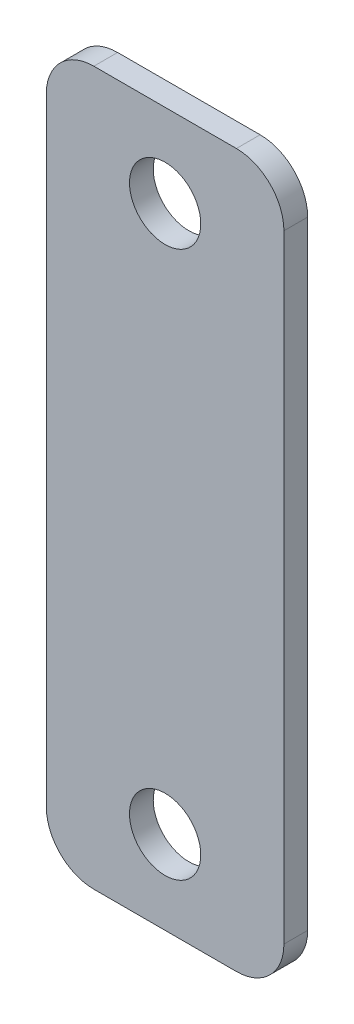
ISO-10303-21;
HEADER;
FILE_DESCRIPTION(('STEP AP214'),'2;1');
FILE_NAME('part.step','',(''),(''),'','','');
FILE_SCHEMA(('AUTOMOTIVE_DESIGN { 1 0 10303 214 1 1 1 1 }'));
ENDSEC;
DATA;
#1=APPLICATION_CONTEXT('core data for automotive mechanical design processes');
#2=APPLICATION_PROTOCOL_DEFINITION('international standard','automotive_design',2000,#1);
#3=PRODUCT_CONTEXT('',#1,'mechanical');
#4=PRODUCT('Part','Part','',(#3));
#5=PRODUCT_RELATED_PRODUCT_CATEGORY('part','',(#4));
#6=PRODUCT_DEFINITION_FORMATION('','',#4);
#7=PRODUCT_DEFINITION_CONTEXT('part definition',#1,'design');
#8=PRODUCT_DEFINITION('design','',#6,#7);
#9=PRODUCT_DEFINITION_SHAPE('','',#8);
#10=(LENGTH_UNIT() NAMED_UNIT(*) SI_UNIT(.MILLI.,.METRE.));
#11=(NAMED_UNIT(*) PLANE_ANGLE_UNIT() SI_UNIT($,.RADIAN.));
#12=(NAMED_UNIT(*) SI_UNIT($,.STERADIAN.) SOLID_ANGLE_UNIT());
#13=UNCERTAINTY_MEASURE_WITH_UNIT(LENGTH_MEASURE(1.E-05),#10,'distance_accuracy_value','');
#14=(GEOMETRIC_REPRESENTATION_CONTEXT(3) GLOBAL_UNCERTAINTY_ASSIGNED_CONTEXT((#13)) GLOBAL_UNIT_ASSIGNED_CONTEXT((#10,
#11,#12)) REPRESENTATION_CONTEXT('',''));
#15=CARTESIAN_POINT('',(0.,0.,0.));
#16=DIRECTION('',(0.,0.,1.));
#17=DIRECTION('',(1.,0.,0.));
#18=AXIS2_PLACEMENT_3D('',#15,#16,#17);
#19=CARTESIAN_POINT('',(5.,-15.,0.5));
#20=DIRECTION('',(-1.,0.,0.));
#21=DIRECTION('',(0.,0.,1.));
#22=AXIS2_PLACEMENT_3D('',#19,#20,#21);
#23=PLANE('',#22);
#24=DIRECTION('',(0.,1.,0.));
#25=VECTOR('',#24,1.);
#26=CARTESIAN_POINT('',(5.,-15.,0.5));
#27=LINE('',#26,#25);
#28=CARTESIAN_POINT('',(5.,-13.,0.5));
#29=VERTEX_POINT('',#28);
#30=CARTESIAN_POINT('',(5.,13.,0.5));
#31=VERTEX_POINT('',#30);
#32=EDGE_CURVE('E119',#29,#31,#27,.T.);
#33=ORIENTED_EDGE('',*,*,#32,.F.);
#34=DIRECTION('',(0.,0.,-1.));
#35=VECTOR('',#34,1.);
#36=CARTESIAN_POINT('',(5.,-13.,0.5));
#37=LINE('',#36,#35);
#38=CARTESIAN_POINT('',(5.,-13.,-0.5));
#39=VERTEX_POINT('',#38);
#40=EDGE_CURVE('E104',#29,#39,#37,.T.);
#41=ORIENTED_EDGE('',*,*,#40,.T.);
#42=DIRECTION('',(0.,1.,0.));
#43=VECTOR('',#42,1.);
#44=CARTESIAN_POINT('',(5.,-15.,-0.5));
#45=LINE('',#44,#43);
#46=CARTESIAN_POINT('',(5.,13.,-0.5));
#47=VERTEX_POINT('',#46);
#48=EDGE_CURVE('E116',#39,#47,#45,.T.);
#49=ORIENTED_EDGE('',*,*,#48,.T.);
#50=DIRECTION('',(0.,0.,-1.));
#51=VECTOR('',#50,1.);
#52=CARTESIAN_POINT('',(5.,13.,0.5));
#53=LINE('',#52,#51);
#54=EDGE_CURVE('E121',#47,#31,#53,.F.);
#55=ORIENTED_EDGE('',*,*,#54,.T.);
#56=EDGE_LOOP('',(#33,#41,#49,#55));
#57=FACE_BOUND('',#56,.T.);
#58=ADVANCED_FACE('F34',(#57),#23,.F.);
#59=CARTESIAN_POINT('',(-5.,15.,0.5));
#60=DIRECTION('',(0.,-1.,0.));
#61=DIRECTION('',(0.,0.,-1.));
#62=AXIS2_PLACEMENT_3D('',#59,#60,#61);
#63=PLANE('',#62);
#64=DIRECTION('',(-1.,0.,0.));
#65=VECTOR('',#64,1.);
#66=CARTESIAN_POINT('',(-5.,15.,-0.5));
#67=LINE('',#66,#65);
#68=CARTESIAN_POINT('',(3.,15.,-0.5));
#69=VERTEX_POINT('',#68);
#70=CARTESIAN_POINT('',(-3.,15.,-0.5));
#71=VERTEX_POINT('',#70);
#72=EDGE_CURVE('E125',#69,#71,#67,.T.);
#73=ORIENTED_EDGE('',*,*,#72,.T.);
#74=DIRECTION('',(0.,0.,-1.));
#75=VECTOR('',#74,1.);
#76=CARTESIAN_POINT('',(-3.,15.,0.5));
#77=LINE('',#76,#75);
#78=CARTESIAN_POINT('',(-3.,15.,0.5));
#79=VERTEX_POINT('',#78);
#80=EDGE_CURVE('E11',#71,#79,#77,.F.);
#81=ORIENTED_EDGE('',*,*,#80,.T.);
#82=DIRECTION('',(-1.,0.,0.));
#83=VECTOR('',#82,1.);
#84=CARTESIAN_POINT('',(-5.,15.,0.5));
#85=LINE('',#84,#83);
#86=CARTESIAN_POINT('',(3.,15.,0.5));
#87=VERTEX_POINT('',#86);
#88=EDGE_CURVE('E168',#87,#79,#85,.T.);
#89=ORIENTED_EDGE('',*,*,#88,.F.);
#90=DIRECTION('',(0.,0.,-1.));
#91=VECTOR('',#90,1.);
#92=CARTESIAN_POINT('',(3.,15.,0.5));
#93=LINE('',#92,#91);
#94=EDGE_CURVE('E42',#87,#69,#93,.T.);
#95=ORIENTED_EDGE('',*,*,#94,.T.);
#96=EDGE_LOOP('',(#73,#81,#89,#95));
#97=FACE_BOUND('',#96,.T.);
#98=ADVANCED_FACE('F166',(#97),#63,.F.);
#99=CARTESIAN_POINT('',(-5.,-15.,0.5));
#100=DIRECTION('',(1.,0.,0.));
#101=DIRECTION('',(0.,0.,-1.));
#102=AXIS2_PLACEMENT_3D('',#99,#100,#101);
#103=PLANE('',#102);
#104=DIRECTION('',(0.,-1.,0.));
#105=VECTOR('',#104,1.);
#106=CARTESIAN_POINT('',(-5.,-15.,-0.5));
#107=LINE('',#106,#105);
#108=CARTESIAN_POINT('',(-5.,13.,-0.5));
#109=VERTEX_POINT('',#108);
#110=CARTESIAN_POINT('',(-5.,-13.,-0.5));
#111=VERTEX_POINT('',#110);
#112=EDGE_CURVE('E129',#109,#111,#107,.T.);
#113=ORIENTED_EDGE('',*,*,#112,.T.);
#114=DIRECTION('',(0.,0.,-1.));
#115=VECTOR('',#114,1.);
#116=CARTESIAN_POINT('',(-5.,-13.,0.5));
#117=LINE('',#116,#115);
#118=CARTESIAN_POINT('',(-5.,-13.,0.5));
#119=VERTEX_POINT('',#118);
#120=EDGE_CURVE('E49',#111,#119,#117,.F.);
#121=ORIENTED_EDGE('',*,*,#120,.T.);
#122=DIRECTION('',(0.,-1.,0.));
#123=VECTOR('',#122,1.);
#124=CARTESIAN_POINT('',(-5.,-15.,0.5));
#125=LINE('',#124,#123);
#126=CARTESIAN_POINT('',(-5.,13.,0.5));
#127=VERTEX_POINT('',#126);
#128=EDGE_CURVE('E176',#127,#119,#125,.T.);
#129=ORIENTED_EDGE('',*,*,#128,.F.);
#130=DIRECTION('',(0.,0.,-1.));
#131=VECTOR('',#130,1.);
#132=CARTESIAN_POINT('',(-5.,13.,0.5));
#133=LINE('',#132,#131);
#134=EDGE_CURVE('E159',#127,#109,#133,.T.);
#135=ORIENTED_EDGE('',*,*,#134,.T.);
#136=EDGE_LOOP('',(#113,#121,#129,#135));
#137=FACE_BOUND('',#136,.T.);
#138=ADVANCED_FACE('F175',(#137),#103,.F.);
#139=CARTESIAN_POINT('',(-5.,-15.,0.5));
#140=DIRECTION('',(0.,1.,0.));
#141=DIRECTION('',(0.,0.,1.));
#142=AXIS2_PLACEMENT_3D('',#139,#140,#141);
#143=PLANE('',#142);
#144=DIRECTION('',(1.,0.,0.));
#145=VECTOR('',#144,1.);
#146=CARTESIAN_POINT('',(-5.,-15.,-0.5));
#147=LINE('',#146,#145);
#148=CARTESIAN_POINT('',(-3.,-15.,-0.5));
#149=VERTEX_POINT('',#148);
#150=CARTESIAN_POINT('',(3.,-15.,-0.5));
#151=VERTEX_POINT('',#150);
#152=EDGE_CURVE('E139',#149,#151,#147,.T.);
#153=ORIENTED_EDGE('',*,*,#152,.T.);
#154=DIRECTION('',(0.,0.,-1.));
#155=VECTOR('',#154,1.);
#156=CARTESIAN_POINT('',(3.,-15.,0.5));
#157=LINE('',#156,#155);
#158=CARTESIAN_POINT('',(3.,-15.,0.5));
#159=VERTEX_POINT('',#158);
#160=EDGE_CURVE('E105',#151,#159,#157,.F.);
#161=ORIENTED_EDGE('',*,*,#160,.T.);
#162=DIRECTION('',(1.,0.,0.));
#163=VECTOR('',#162,1.);
#164=CARTESIAN_POINT('',(-5.,-15.,0.5));
#165=LINE('',#164,#163);
#166=CARTESIAN_POINT('',(-3.,-15.,0.5));
#167=VERTEX_POINT('',#166);
#168=EDGE_CURVE('E135',#167,#159,#165,.T.);
#169=ORIENTED_EDGE('',*,*,#168,.F.);
#170=DIRECTION('',(0.,0.,-1.));
#171=VECTOR('',#170,1.);
#172=CARTESIAN_POINT('',(-3.,-15.,0.5));
#173=LINE('',#172,#171);
#174=EDGE_CURVE('E110',#167,#149,#173,.T.);
#175=ORIENTED_EDGE('',*,*,#174,.T.);
#176=EDGE_LOOP('',(#153,#161,#169,#175));
#177=FACE_BOUND('',#176,.T.);
#178=ADVANCED_FACE('F193',(#177),#143,.F.);
#179=CARTESIAN_POINT('',(0.,0.,0.5));
#180=DIRECTION('',(0.,0.,-1.));
#181=DIRECTION('',(-1.,0.,0.));
#182=AXIS2_PLACEMENT_3D('',#179,#180,#181);
#183=PLANE('',#182);
#184=CARTESIAN_POINT('',(0.,11.5,0.5));
#185=DIRECTION('',(0.,0.,1.));
#186=DIRECTION('',(1.,0.,0.));
#187=AXIS2_PLACEMENT_3D('',#184,#185,#186);
#188=CIRCLE('',#187,1.5);
#189=CARTESIAN_POINT('',(1.5,11.5,0.5));
#190=VERTEX_POINT('',#189);
#191=EDGE_CURVE('E142',#190,#190,#188,.T.);
#192=ORIENTED_EDGE('',*,*,#191,.F.);
#193=EDGE_LOOP('',(#192));
#194=FACE_BOUND('',#193,.T.);
#195=CARTESIAN_POINT('',(0.,-11.5,0.5));
#196=DIRECTION('',(0.,0.,1.));
#197=DIRECTION('',(1.,0.,0.));
#198=AXIS2_PLACEMENT_3D('',#195,#196,#197);
#199=CIRCLE('',#198,1.5);
#200=CARTESIAN_POINT('',(1.5,-11.5,0.5));
#201=VERTEX_POINT('',#200);
#202=EDGE_CURVE('E182',#201,#201,#199,.T.);
#203=ORIENTED_EDGE('',*,*,#202,.F.);
#204=EDGE_LOOP('',(#203));
#205=FACE_BOUND('',#204,.T.);
#206=ORIENTED_EDGE('',*,*,#168,.T.);
#207=CARTESIAN_POINT('',(3.,-13.,0.5));
#208=DIRECTION('',(0.,0.,-1.));
#209=DIRECTION('',(-1.,0.,0.));
#210=AXIS2_PLACEMENT_3D('',#207,#208,#209);
#211=CIRCLE('',#210,2.);
#212=EDGE_CURVE('E157',#159,#29,#211,.F.);
#213=ORIENTED_EDGE('',*,*,#212,.T.);
#214=ORIENTED_EDGE('',*,*,#32,.T.);
#215=CARTESIAN_POINT('',(3.,13.,0.5));
#216=DIRECTION('',(0.,0.,-1.));
#217=DIRECTION('',(-1.,0.,0.));
#218=AXIS2_PLACEMENT_3D('',#215,#216,#217);
#219=CIRCLE('',#218,2.);
#220=EDGE_CURVE('E152',#31,#87,#219,.F.);
#221=ORIENTED_EDGE('',*,*,#220,.T.);
#222=ORIENTED_EDGE('',*,*,#88,.T.);
#223=CARTESIAN_POINT('',(-3.,13.,0.5));
#224=DIRECTION('',(0.,0.,-1.));
#225=DIRECTION('',(-1.,0.,0.));
#226=AXIS2_PLACEMENT_3D('',#223,#224,#225);
#227=CIRCLE('',#226,2.);
#228=EDGE_CURVE('E56',#79,#127,#227,.F.);
#229=ORIENTED_EDGE('',*,*,#228,.T.);
#230=ORIENTED_EDGE('',*,*,#128,.T.);
#231=CARTESIAN_POINT('',(-3.,-13.,0.5));
#232=DIRECTION('',(0.,0.,-1.));
#233=DIRECTION('',(-1.,0.,0.));
#234=AXIS2_PLACEMENT_3D('',#231,#232,#233);
#235=CIRCLE('',#234,2.);
#236=EDGE_CURVE('E155',#119,#167,#235,.F.);
#237=ORIENTED_EDGE('',*,*,#236,.T.);
#238=EDGE_LOOP('',(#206,#213,#214,#221,#222,#229,#230,#237));
#239=FACE_BOUND('',#238,.T.);
#240=ADVANCED_FACE('F190',(#194,#205,#239),#183,.F.);
#241=CARTESIAN_POINT('',(0.,0.,-0.5));
#242=DIRECTION('',(0.,0.,-1.));
#243=DIRECTION('',(-1.,0.,0.));
#244=AXIS2_PLACEMENT_3D('',#241,#242,#243);
#245=PLANE('',#244);
#246=CARTESIAN_POINT('',(0.,11.5,-0.5));
#247=DIRECTION('',(0.,0.,-1.));
#248=DIRECTION('',(-1.,0.,0.));
#249=AXIS2_PLACEMENT_3D('',#246,#247,#248);
#250=CIRCLE('',#249,1.5);
#251=CARTESIAN_POINT('',(-1.5,11.5,-0.5));
#252=VERTEX_POINT('',#251);
#253=EDGE_CURVE('E126',#252,#252,#250,.T.);
#254=ORIENTED_EDGE('',*,*,#253,.F.);
#255=EDGE_LOOP('',(#254));
#256=FACE_BOUND('',#255,.T.);
#257=CARTESIAN_POINT('',(0.,-11.5,-0.5));
#258=DIRECTION('',(0.,0.,-1.));
#259=DIRECTION('',(-1.,0.,0.));
#260=AXIS2_PLACEMENT_3D('',#257,#258,#259);
#261=CIRCLE('',#260,1.5);
#262=CARTESIAN_POINT('',(-1.5,-11.5,-0.5));
#263=VERTEX_POINT('',#262);
#264=EDGE_CURVE('E132',#263,#263,#261,.T.);
#265=ORIENTED_EDGE('',*,*,#264,.F.);
#266=EDGE_LOOP('',(#265));
#267=FACE_BOUND('',#266,.T.);
#268=ORIENTED_EDGE('',*,*,#48,.F.);
#269=CARTESIAN_POINT('',(3.,-13.,-0.5));
#270=DIRECTION('',(0.,0.,-1.));
#271=DIRECTION('',(-1.,0.,0.));
#272=AXIS2_PLACEMENT_3D('',#269,#270,#271);
#273=CIRCLE('',#272,2.);
#274=EDGE_CURVE('E100',#39,#151,#273,.T.);
#275=ORIENTED_EDGE('',*,*,#274,.T.);
#276=ORIENTED_EDGE('',*,*,#152,.F.);
#277=CARTESIAN_POINT('',(-3.,-13.,-0.5));
#278=DIRECTION('',(0.,0.,-1.));
#279=DIRECTION('',(-1.,0.,0.));
#280=AXIS2_PLACEMENT_3D('',#277,#278,#279);
#281=CIRCLE('',#280,2.);
#282=EDGE_CURVE('E111',#149,#111,#281,.T.);
#283=ORIENTED_EDGE('',*,*,#282,.T.);
#284=ORIENTED_EDGE('',*,*,#112,.F.);
#285=CARTESIAN_POINT('',(-3.,13.,-0.5));
#286=DIRECTION('',(0.,0.,-1.));
#287=DIRECTION('',(-1.,0.,0.));
#288=AXIS2_PLACEMENT_3D('',#285,#286,#287);
#289=CIRCLE('',#288,2.);
#290=EDGE_CURVE('E146',#109,#71,#289,.T.);
#291=ORIENTED_EDGE('',*,*,#290,.T.);
#292=ORIENTED_EDGE('',*,*,#72,.F.);
#293=CARTESIAN_POINT('',(3.,13.,-0.5));
#294=DIRECTION('',(0.,0.,-1.));
#295=DIRECTION('',(-1.,0.,0.));
#296=AXIS2_PLACEMENT_3D('',#293,#294,#295);
#297=CIRCLE('',#296,2.);
#298=EDGE_CURVE('E120',#69,#47,#297,.T.);
#299=ORIENTED_EDGE('',*,*,#298,.T.);
#300=EDGE_LOOP('',(#268,#275,#276,#283,#284,#291,#292,#299));
#301=FACE_BOUND('',#300,.T.);
#302=ADVANCED_FACE('F123',(#256,#267,#301),#245,.T.);
#303=CARTESIAN_POINT('',(0.,-11.5,-9.5));
#304=DIRECTION('',(0.,0.,1.));
#305=DIRECTION('',(1.,0.,0.));
#306=AXIS2_PLACEMENT_3D('',#303,#304,#305);
#307=CYLINDRICAL_SURFACE('',#306,1.5);
#308=ORIENTED_EDGE('',*,*,#264,.T.);
#309=EDGE_LOOP('',(#308));
#310=FACE_BOUND('',#309,.T.);
#311=ORIENTED_EDGE('',*,*,#202,.T.);
#312=EDGE_LOOP('',(#311));
#313=FACE_BOUND('',#312,.T.);
#314=ADVANCED_FACE('F220',(#310,#313),#307,.F.);
#315=CARTESIAN_POINT('',(0.,11.5,-9.5));
#316=DIRECTION('',(0.,0.,1.));
#317=DIRECTION('',(1.,0.,0.));
#318=AXIS2_PLACEMENT_3D('',#315,#316,#317);
#319=CYLINDRICAL_SURFACE('',#318,1.5);
#320=ORIENTED_EDGE('',*,*,#253,.T.);
#321=EDGE_LOOP('',(#320));
#322=FACE_BOUND('',#321,.T.);
#323=ORIENTED_EDGE('',*,*,#191,.T.);
#324=EDGE_LOOP('',(#323));
#325=FACE_BOUND('',#324,.T.);
#326=ADVANCED_FACE('F188',(#322,#325),#319,.F.);
#327=CARTESIAN_POINT('',(3.,-13.,0.5));
#328=DIRECTION('',(0.,0.,-1.));
#329=DIRECTION('',(-1.,0.,0.));
#330=AXIS2_PLACEMENT_3D('',#327,#328,#329);
#331=CYLINDRICAL_SURFACE('',#330,2.);
#332=ORIENTED_EDGE('',*,*,#212,.F.);
#333=ORIENTED_EDGE('',*,*,#160,.F.);
#334=ORIENTED_EDGE('',*,*,#274,.F.);
#335=ORIENTED_EDGE('',*,*,#40,.F.);
#336=EDGE_LOOP('',(#332,#333,#334,#335));
#337=FACE_BOUND('',#336,.T.);
#338=ADVANCED_FACE('F103',(#337),#331,.T.);
#339=CARTESIAN_POINT('',(-3.,-13.,0.5));
#340=DIRECTION('',(0.,0.,-1.));
#341=DIRECTION('',(-1.,0.,0.));
#342=AXIS2_PLACEMENT_3D('',#339,#340,#341);
#343=CYLINDRICAL_SURFACE('',#342,2.);
#344=ORIENTED_EDGE('',*,*,#236,.F.);
#345=ORIENTED_EDGE('',*,*,#120,.F.);
#346=ORIENTED_EDGE('',*,*,#282,.F.);
#347=ORIENTED_EDGE('',*,*,#174,.F.);
#348=EDGE_LOOP('',(#344,#345,#346,#347));
#349=FACE_BOUND('',#348,.T.);
#350=ADVANCED_FACE('F200',(#349),#343,.T.);
#351=CARTESIAN_POINT('',(-3.,13.,0.5));
#352=DIRECTION('',(0.,0.,-1.));
#353=DIRECTION('',(-1.,0.,0.));
#354=AXIS2_PLACEMENT_3D('',#351,#352,#353);
#355=CYLINDRICAL_SURFACE('',#354,2.);
#356=ORIENTED_EDGE('',*,*,#228,.F.);
#357=ORIENTED_EDGE('',*,*,#80,.F.);
#358=ORIENTED_EDGE('',*,*,#290,.F.);
#359=ORIENTED_EDGE('',*,*,#134,.F.);
#360=EDGE_LOOP('',(#356,#357,#358,#359));
#361=FACE_BOUND('',#360,.T.);
#362=ADVANCED_FACE('F174',(#361),#355,.T.);
#363=CARTESIAN_POINT('',(3.,13.,0.5));
#364=DIRECTION('',(0.,0.,-1.));
#365=DIRECTION('',(-1.,0.,0.));
#366=AXIS2_PLACEMENT_3D('',#363,#364,#365);
#367=CYLINDRICAL_SURFACE('',#366,2.);
#368=ORIENTED_EDGE('',*,*,#220,.F.);
#369=ORIENTED_EDGE('',*,*,#54,.F.);
#370=ORIENTED_EDGE('',*,*,#298,.F.);
#371=ORIENTED_EDGE('',*,*,#94,.F.);
#372=EDGE_LOOP('',(#368,#369,#370,#371));
#373=FACE_BOUND('',#372,.T.);
#374=ADVANCED_FACE('F36',(#373),#367,.T.);
#375=CLOSED_SHELL('',(#58,#98,#138,#178,#240,#302,#314,#326,#338,#350,#362,#374));
#376=MANIFOLD_SOLID_BREP('B2',#375);
#377=ADVANCED_BREP_SHAPE_REPRESENTATION('',(#18,#376),#14);
#378=SHAPE_DEFINITION_REPRESENTATION(#9,#377);
ENDSEC;
END-ISO-10303-21;
